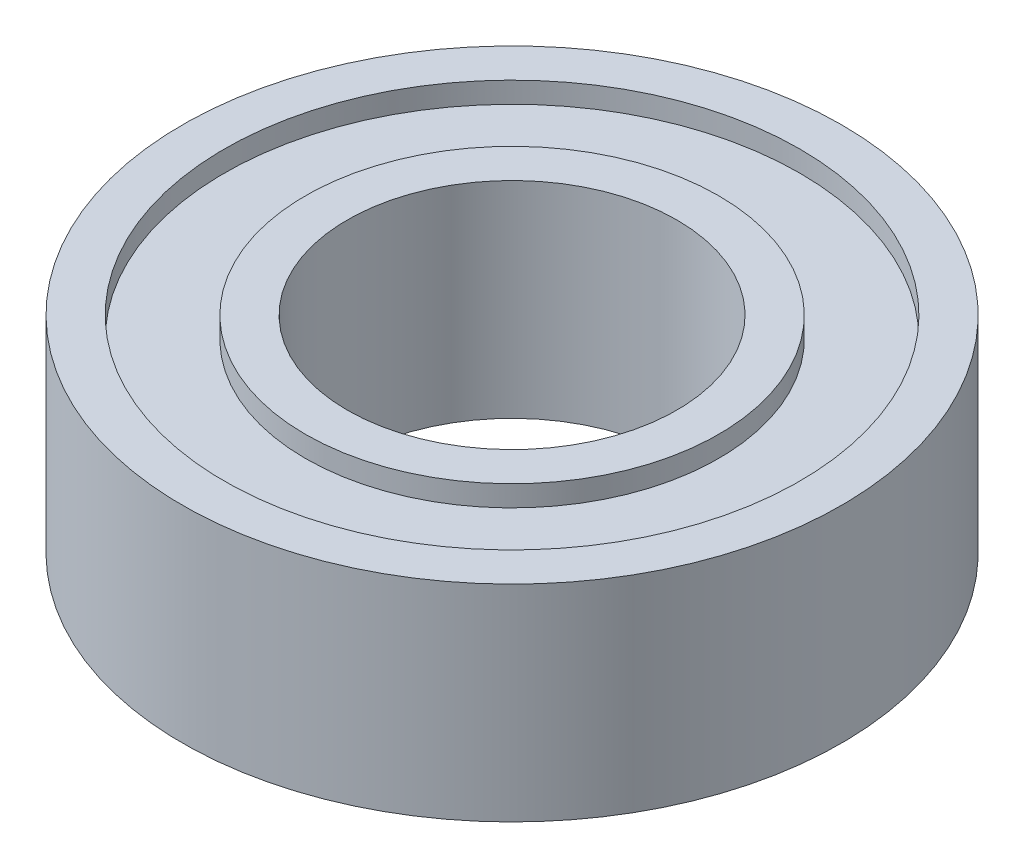
ISO-10303-21;
HEADER;
FILE_DESCRIPTION(('STEP AP214'),'2;1');
FILE_NAME('part.step','',(''),(''),'','','');
FILE_SCHEMA(('AUTOMOTIVE_DESIGN { 1 0 10303 214 1 1 1 1 }'));
ENDSEC;
DATA;
#1=APPLICATION_CONTEXT('core data for automotive mechanical design processes');
#2=APPLICATION_PROTOCOL_DEFINITION('international standard','automotive_design',2000,#1);
#3=PRODUCT_CONTEXT('',#1,'mechanical');
#4=PRODUCT('Part','Part','',(#3));
#5=PRODUCT_RELATED_PRODUCT_CATEGORY('part','',(#4));
#6=PRODUCT_DEFINITION_FORMATION('','',#4);
#7=PRODUCT_DEFINITION_CONTEXT('part definition',#1,'design');
#8=PRODUCT_DEFINITION('design','',#6,#7);
#9=PRODUCT_DEFINITION_SHAPE('','',#8);
#10=(LENGTH_UNIT() NAMED_UNIT(*) SI_UNIT(.MILLI.,.METRE.));
#11=(NAMED_UNIT(*) PLANE_ANGLE_UNIT() SI_UNIT($,.RADIAN.));
#12=(NAMED_UNIT(*) SI_UNIT($,.STERADIAN.) SOLID_ANGLE_UNIT());
#13=UNCERTAINTY_MEASURE_WITH_UNIT(LENGTH_MEASURE(1.E-05),#10,'distance_accuracy_value','');
#14=(GEOMETRIC_REPRESENTATION_CONTEXT(3) GLOBAL_UNCERTAINTY_ASSIGNED_CONTEXT((#13)) GLOBAL_UNIT_ASSIGNED_CONTEXT((#10,
#11,#12)) REPRESENTATION_CONTEXT('',''));
#15=CARTESIAN_POINT('',(0.,0.,0.));
#16=DIRECTION('',(0.,0.,1.));
#17=DIRECTION('',(1.,0.,0.));
#18=AXIS2_PLACEMENT_3D('',#15,#16,#17);
#19=CARTESIAN_POINT('',(0.,0.,0.));
#20=DIRECTION('',(0.,-1.,0.));
#21=DIRECTION('',(0.,0.,-1.));
#22=AXIS2_PLACEMENT_3D('',#19,#20,#21);
#23=CYLINDRICAL_SURFACE('',#22,4.);
#24=CARTESIAN_POINT('',(0.,5.,0.));
#25=DIRECTION('',(0.,-1.,0.));
#26=DIRECTION('',(0.,0.,-1.));
#27=AXIS2_PLACEMENT_3D('',#24,#25,#26);
#28=CIRCLE('',#27,4.);
#29=CARTESIAN_POINT('',(0.,5.,-4.));
#30=VERTEX_POINT('',#29);
#31=EDGE_CURVE('E26',#30,#30,#28,.F.);
#32=ORIENTED_EDGE('',*,*,#31,.T.);
#33=EDGE_LOOP('',(#32));
#34=FACE_BOUND('',#33,.T.);
#35=CARTESIAN_POINT('',(0.,0.,0.));
#36=DIRECTION('',(0.,-1.,0.));
#37=DIRECTION('',(0.,0.,-1.));
#38=AXIS2_PLACEMENT_3D('',#35,#36,#37);
#39=CIRCLE('',#38,4.);
#40=CARTESIAN_POINT('',(0.,0.,-4.));
#41=VERTEX_POINT('',#40);
#42=EDGE_CURVE('E71',#41,#41,#39,.T.);
#43=ORIENTED_EDGE('',*,*,#42,.T.);
#44=EDGE_LOOP('',(#43));
#45=FACE_BOUND('',#44,.T.);
#46=ADVANCED_FACE('F23',(#34,#45),#23,.F.);
#47=CARTESIAN_POINT('',(0.,5.,4.));
#48=DIRECTION('',(0.,-1.,0.));
#49=DIRECTION('',(0.,0.,-1.));
#50=AXIS2_PLACEMENT_3D('',#47,#48,#49);
#51=PLANE('',#50);
#52=ORIENTED_EDGE('',*,*,#31,.F.);
#53=EDGE_LOOP('',(#52));
#54=FACE_BOUND('',#53,.T.);
#55=CARTESIAN_POINT('',(0.,5.,0.));
#56=DIRECTION('',(0.,-1.,0.));
#57=DIRECTION('',(0.,0.,-1.));
#58=AXIS2_PLACEMENT_3D('',#55,#56,#57);
#59=CIRCLE('',#58,5.016);
#60=CARTESIAN_POINT('',(0.,5.,-5.016));
#61=VERTEX_POINT('',#60);
#62=EDGE_CURVE('E68',#61,#61,#59,.T.);
#63=ORIENTED_EDGE('',*,*,#62,.F.);
#64=EDGE_LOOP('',(#63));
#65=FACE_BOUND('',#64,.T.);
#66=ADVANCED_FACE('F84',(#54,#65),#51,.F.);
#67=CARTESIAN_POINT('',(0.,0.,5.016));
#68=DIRECTION('',(0.,1.,0.));
#69=DIRECTION('',(0.,0.,1.));
#70=AXIS2_PLACEMENT_3D('',#67,#68,#69);
#71=PLANE('',#70);
#72=CARTESIAN_POINT('',(0.,0.,0.));
#73=DIRECTION('',(0.,-1.,0.));
#74=DIRECTION('',(0.,0.,-1.));
#75=AXIS2_PLACEMENT_3D('',#72,#73,#74);
#76=CIRCLE('',#75,5.016);
#77=CARTESIAN_POINT('',(0.,0.,-5.016));
#78=VERTEX_POINT('',#77);
#79=EDGE_CURVE('E64',#78,#78,#76,.F.);
#80=ORIENTED_EDGE('',*,*,#79,.F.);
#81=EDGE_LOOP('',(#80));
#82=FACE_BOUND('',#81,.T.);
#83=ORIENTED_EDGE('',*,*,#42,.F.);
#84=EDGE_LOOP('',(#83));
#85=FACE_BOUND('',#84,.T.);
#86=ADVANCED_FACE('F87',(#82,#85),#71,.F.);
#87=CARTESIAN_POINT('',(0.,0.,0.));
#88=DIRECTION('',(0.,-1.,0.));
#89=DIRECTION('',(0.,0.,-1.));
#90=AXIS2_PLACEMENT_3D('',#87,#88,#89);
#91=CYLINDRICAL_SURFACE('',#90,5.016);
#92=CARTESIAN_POINT('',(0.,4.492,0.));
#93=DIRECTION('',(0.,-1.,0.));
#94=DIRECTION('',(0.,0.,-1.));
#95=AXIS2_PLACEMENT_3D('',#92,#93,#94);
#96=CIRCLE('',#95,5.016);
#97=CARTESIAN_POINT('',(0.,4.492,-5.016));
#98=VERTEX_POINT('',#97);
#99=EDGE_CURVE('E60',#98,#98,#96,.F.);
#100=ORIENTED_EDGE('',*,*,#99,.T.);
#101=EDGE_LOOP('',(#100));
#102=FACE_BOUND('',#101,.T.);
#103=ORIENTED_EDGE('',*,*,#62,.T.);
#104=EDGE_LOOP('',(#103));
#105=FACE_BOUND('',#104,.T.);
#106=ADVANCED_FACE('F90',(#102,#105),#91,.T.);
#107=CARTESIAN_POINT('',(0.,0.,0.));
#108=DIRECTION('',(0.,-1.,0.));
#109=DIRECTION('',(0.,0.,-1.));
#110=AXIS2_PLACEMENT_3D('',#107,#108,#109);
#111=CYLINDRICAL_SURFACE('',#110,5.016);
#112=ORIENTED_EDGE('',*,*,#79,.T.);
#113=EDGE_LOOP('',(#112));
#114=FACE_BOUND('',#113,.T.);
#115=CARTESIAN_POINT('',(0.,0.508,0.));
#116=DIRECTION('',(0.,-1.,0.));
#117=DIRECTION('',(0.,0.,-1.));
#118=AXIS2_PLACEMENT_3D('',#115,#116,#117);
#119=CIRCLE('',#118,5.016);
#120=CARTESIAN_POINT('',(0.,0.508,-5.016));
#121=VERTEX_POINT('',#120);
#122=EDGE_CURVE('E56',#121,#121,#119,.T.);
#123=ORIENTED_EDGE('',*,*,#122,.T.);
#124=EDGE_LOOP('',(#123));
#125=FACE_BOUND('',#124,.T.);
#126=ADVANCED_FACE('F92',(#114,#125),#111,.T.);
#127=CARTESIAN_POINT('',(0.,4.492,5.016));
#128=DIRECTION('',(0.,-1.,0.));
#129=DIRECTION('',(0.,0.,-1.));
#130=AXIS2_PLACEMENT_3D('',#127,#128,#129);
#131=PLANE('',#130);
#132=ORIENTED_EDGE('',*,*,#99,.F.);
#133=EDGE_LOOP('',(#132));
#134=FACE_BOUND('',#133,.T.);
#135=CARTESIAN_POINT('',(0.,4.492,0.));
#136=DIRECTION('',(0.,-1.,0.));
#137=DIRECTION('',(0.,0.,-1.));
#138=AXIS2_PLACEMENT_3D('',#135,#136,#137);
#139=CIRCLE('',#138,6.984);
#140=CARTESIAN_POINT('',(0.,4.492,-6.984));
#141=VERTEX_POINT('',#140);
#142=EDGE_CURVE('E52',#141,#141,#139,.F.);
#143=ORIENTED_EDGE('',*,*,#142,.T.);
#144=EDGE_LOOP('',(#143));
#145=FACE_BOUND('',#144,.T.);
#146=ADVANCED_FACE('F100',(#134,#145),#131,.F.);
#147=CARTESIAN_POINT('',(0.,0.508,6.984));
#148=DIRECTION('',(0.,1.,0.));
#149=DIRECTION('',(0.,0.,1.));
#150=AXIS2_PLACEMENT_3D('',#147,#148,#149);
#151=PLANE('',#150);
#152=CARTESIAN_POINT('',(0.,0.508,0.));
#153=DIRECTION('',(0.,-1.,0.));
#154=DIRECTION('',(0.,0.,-1.));
#155=AXIS2_PLACEMENT_3D('',#152,#153,#154);
#156=CIRCLE('',#155,6.984);
#157=CARTESIAN_POINT('',(0.,0.508,-6.984));
#158=VERTEX_POINT('',#157);
#159=EDGE_CURVE('E48',#158,#158,#156,.T.);
#160=ORIENTED_EDGE('',*,*,#159,.T.);
#161=EDGE_LOOP('',(#160));
#162=FACE_BOUND('',#161,.T.);
#163=ORIENTED_EDGE('',*,*,#122,.F.);
#164=EDGE_LOOP('',(#163));
#165=FACE_BOUND('',#164,.T.);
#166=ADVANCED_FACE('F128',(#162,#165),#151,.F.);
#167=CARTESIAN_POINT('',(0.,0.,0.));
#168=DIRECTION('',(0.,-1.,0.));
#169=DIRECTION('',(0.,0.,-1.));
#170=AXIS2_PLACEMENT_3D('',#167,#168,#169);
#171=CYLINDRICAL_SURFACE('',#170,6.984);
#172=CARTESIAN_POINT('',(0.,5.,0.));
#173=DIRECTION('',(0.,-1.,0.));
#174=DIRECTION('',(0.,0.,-1.));
#175=AXIS2_PLACEMENT_3D('',#172,#173,#174);
#176=CIRCLE('',#175,6.984);
#177=CARTESIAN_POINT('',(0.,5.,-6.984));
#178=VERTEX_POINT('',#177);
#179=EDGE_CURVE('E44',#178,#178,#176,.F.);
#180=ORIENTED_EDGE('',*,*,#179,.T.);
#181=EDGE_LOOP('',(#180));
#182=FACE_BOUND('',#181,.T.);
#183=ORIENTED_EDGE('',*,*,#142,.F.);
#184=EDGE_LOOP('',(#183));
#185=FACE_BOUND('',#184,.T.);
#186=ADVANCED_FACE('F124',(#182,#185),#171,.F.);
#187=CARTESIAN_POINT('',(0.,0.,0.));
#188=DIRECTION('',(0.,-1.,0.));
#189=DIRECTION('',(0.,0.,-1.));
#190=AXIS2_PLACEMENT_3D('',#187,#188,#189);
#191=CYLINDRICAL_SURFACE('',#190,6.984);
#192=ORIENTED_EDGE('',*,*,#159,.F.);
#193=EDGE_LOOP('',(#192));
#194=FACE_BOUND('',#193,.T.);
#195=CARTESIAN_POINT('',(0.,0.,0.));
#196=DIRECTION('',(0.,-1.,0.));
#197=DIRECTION('',(0.,0.,-1.));
#198=AXIS2_PLACEMENT_3D('',#195,#196,#197);
#199=CIRCLE('',#198,6.984);
#200=CARTESIAN_POINT('',(0.,0.,-6.984));
#201=VERTEX_POINT('',#200);
#202=EDGE_CURVE('E39',#201,#201,#199,.T.);
#203=ORIENTED_EDGE('',*,*,#202,.T.);
#204=EDGE_LOOP('',(#203));
#205=FACE_BOUND('',#204,.T.);
#206=ADVANCED_FACE('F120',(#194,#205),#191,.F.);
#207=CARTESIAN_POINT('',(0.,5.,6.984));
#208=DIRECTION('',(0.,-1.,0.));
#209=DIRECTION('',(0.,0.,-1.));
#210=AXIS2_PLACEMENT_3D('',#207,#208,#209);
#211=PLANE('',#210);
#212=ORIENTED_EDGE('',*,*,#179,.F.);
#213=EDGE_LOOP('',(#212));
#214=FACE_BOUND('',#213,.T.);
#215=CARTESIAN_POINT('',(0.,5.,0.));
#216=DIRECTION('',(0.,-1.,0.));
#217=DIRECTION('',(0.,0.,-1.));
#218=AXIS2_PLACEMENT_3D('',#215,#216,#217);
#219=CIRCLE('',#218,8.);
#220=CARTESIAN_POINT('',(0.,5.,-8.));
#221=VERTEX_POINT('',#220);
#222=EDGE_CURVE('E31',#221,#221,#219,.T.);
#223=ORIENTED_EDGE('',*,*,#222,.F.);
#224=EDGE_LOOP('',(#223));
#225=FACE_BOUND('',#224,.T.);
#226=ADVANCED_FACE('F113',(#214,#225),#211,.F.);
#227=CARTESIAN_POINT('',(0.,0.,8.));
#228=DIRECTION('',(0.,1.,0.));
#229=DIRECTION('',(0.,0.,1.));
#230=AXIS2_PLACEMENT_3D('',#227,#228,#229);
#231=PLANE('',#230);
#232=CARTESIAN_POINT('',(0.,0.,0.));
#233=DIRECTION('',(0.,-1.,0.));
#234=DIRECTION('',(0.,0.,-1.));
#235=AXIS2_PLACEMENT_3D('',#232,#233,#234);
#236=CIRCLE('',#235,8.);
#237=CARTESIAN_POINT('',(0.,0.,-8.));
#238=VERTEX_POINT('',#237);
#239=EDGE_CURVE('E12',#238,#238,#236,.F.);
#240=ORIENTED_EDGE('',*,*,#239,.F.);
#241=EDGE_LOOP('',(#240));
#242=FACE_BOUND('',#241,.T.);
#243=ORIENTED_EDGE('',*,*,#202,.F.);
#244=EDGE_LOOP('',(#243));
#245=FACE_BOUND('',#244,.T.);
#246=ADVANCED_FACE('F107',(#242,#245),#231,.F.);
#247=CARTESIAN_POINT('',(0.,0.,0.));
#248=DIRECTION('',(0.,-1.,0.));
#249=DIRECTION('',(0.,0.,-1.));
#250=AXIS2_PLACEMENT_3D('',#247,#248,#249);
#251=CYLINDRICAL_SURFACE('',#250,8.);
#252=ORIENTED_EDGE('',*,*,#239,.T.);
#253=EDGE_LOOP('',(#252));
#254=FACE_BOUND('',#253,.T.);
#255=ORIENTED_EDGE('',*,*,#222,.T.);
#256=EDGE_LOOP('',(#255));
#257=FACE_BOUND('',#256,.T.);
#258=ADVANCED_FACE('F105',(#254,#257),#251,.T.);
#259=CLOSED_SHELL('',(#46,#66,#86,#106,#126,#146,#166,#186,#206,#226,#246,#258));
#260=MANIFOLD_SOLID_BREP('B1',#259);
#261=ADVANCED_BREP_SHAPE_REPRESENTATION('',(#18,#260),#14);
#262=SHAPE_DEFINITION_REPRESENTATION(#9,#261);
ENDSEC;
END-ISO-10303-21;
